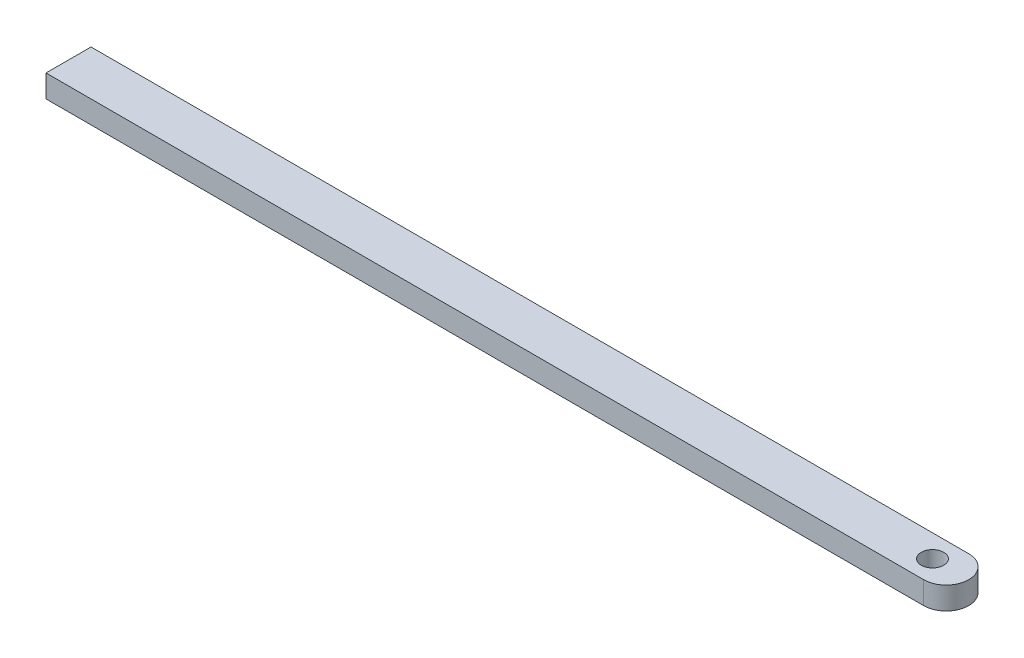
ISO-10303-21;
HEADER;
FILE_DESCRIPTION(('STEP AP214'),'2;1');
FILE_NAME('part.step','',(''),(''),'','','');
FILE_SCHEMA(('AUTOMOTIVE_DESIGN { 1 0 10303 214 1 1 1 1 }'));
ENDSEC;
DATA;
#1=APPLICATION_CONTEXT('core data for automotive mechanical design processes');
#2=APPLICATION_PROTOCOL_DEFINITION('international standard','automotive_design',2000,#1);
#3=PRODUCT_CONTEXT('',#1,'mechanical');
#4=PRODUCT('Part','Part','',(#3));
#5=PRODUCT_RELATED_PRODUCT_CATEGORY('part','',(#4));
#6=PRODUCT_DEFINITION_FORMATION('','',#4);
#7=PRODUCT_DEFINITION_CONTEXT('part definition',#1,'design');
#8=PRODUCT_DEFINITION('design','',#6,#7);
#9=PRODUCT_DEFINITION_SHAPE('','',#8);
#10=(LENGTH_UNIT() NAMED_UNIT(*) SI_UNIT(.MILLI.,.METRE.));
#11=(NAMED_UNIT(*) PLANE_ANGLE_UNIT() SI_UNIT($,.RADIAN.));
#12=(NAMED_UNIT(*) SI_UNIT($,.STERADIAN.) SOLID_ANGLE_UNIT());
#13=UNCERTAINTY_MEASURE_WITH_UNIT(LENGTH_MEASURE(1.E-05),#10,'distance_accuracy_value','');
#14=(GEOMETRIC_REPRESENTATION_CONTEXT(3) GLOBAL_UNCERTAINTY_ASSIGNED_CONTEXT((#13)) GLOBAL_UNIT_ASSIGNED_CONTEXT((#10,
#11,#12)) REPRESENTATION_CONTEXT('',''));
#15=CARTESIAN_POINT('',(0.,0.,0.));
#16=DIRECTION('',(0.,0.,1.));
#17=DIRECTION('',(1.,0.,0.));
#18=AXIS2_PLACEMENT_3D('',#15,#16,#17);
#19=CARTESIAN_POINT('',(279.044360902256,10.,13.6732731770124));
#20=DIRECTION('',(0.,-1.,0.));
#21=DIRECTION('',(0.,0.,-1.));
#22=AXIS2_PLACEMENT_3D('',#19,#20,#21);
#23=CYLINDRICAL_SURFACE('',#22,10.);
#24=DIRECTION('',(0.,-1.,0.));
#25=VECTOR('',#24,1.);
#26=CARTESIAN_POINT('',(279.044360902256,10.,3.67327317701239));
#27=LINE('',#26,#25);
#28=CARTESIAN_POINT('',(279.044360902256,10.,3.67327317701239));
#29=VERTEX_POINT('',#28);
#30=CARTESIAN_POINT('',(279.044360902256,0.,3.67327317701239));
#31=VERTEX_POINT('',#30);
#32=EDGE_CURVE('E97',#29,#31,#27,.T.);
#33=ORIENTED_EDGE('',*,*,#32,.F.);
#34=CARTESIAN_POINT('',(279.044360902256,10.,13.6732731770124));
#35=DIRECTION('',(0.,1.,0.));
#36=DIRECTION('',(0.,0.,1.));
#37=AXIS2_PLACEMENT_3D('',#34,#35,#36);
#38=CIRCLE('',#37,10.);
#39=CARTESIAN_POINT('',(279.044360902256,10.,23.6732731770124));
#40=VERTEX_POINT('',#39);
#41=EDGE_CURVE('E43',#40,#29,#38,.T.);
#42=ORIENTED_EDGE('',*,*,#41,.F.);
#43=DIRECTION('',(0.,-1.,0.));
#44=VECTOR('',#43,1.);
#45=CARTESIAN_POINT('',(279.044360902256,10.,23.6732731770124));
#46=LINE('',#45,#44);
#47=CARTESIAN_POINT('',(279.044360902256,0.,23.6732731770124));
#48=VERTEX_POINT('',#47);
#49=EDGE_CURVE('E80',#48,#40,#46,.F.);
#50=ORIENTED_EDGE('',*,*,#49,.F.);
#51=CARTESIAN_POINT('',(279.044360902256,0.,13.6732731770124));
#52=DIRECTION('',(0.,1.,0.));
#53=DIRECTION('',(0.,0.,1.));
#54=AXIS2_PLACEMENT_3D('',#51,#52,#53);
#55=CIRCLE('',#54,10.);
#56=EDGE_CURVE('E11',#31,#48,#55,.F.);
#57=ORIENTED_EDGE('',*,*,#56,.F.);
#58=EDGE_LOOP('',(#33,#42,#50,#57));
#59=FACE_BOUND('',#58,.T.);
#60=ADVANCED_FACE('F35',(#59),#23,.T.);
#61=CARTESIAN_POINT('',(0.,10.,0.));
#62=DIRECTION('',(0.,1.,0.));
#63=DIRECTION('',(0.,0.,1.));
#64=AXIS2_PLACEMENT_3D('',#61,#62,#63);
#65=PLANE('',#64);
#66=DIRECTION('',(1.,0.,0.));
#67=VECTOR('',#66,1.);
#68=CARTESIAN_POINT('',(-110.955639097744,10.,23.6732731770124));
#69=LINE('',#68,#67);
#70=CARTESIAN_POINT('',(-110.955639097744,10.,23.6732731770124));
#71=VERTEX_POINT('',#70);
#72=EDGE_CURVE('E73',#71,#40,#69,.T.);
#73=ORIENTED_EDGE('',*,*,#72,.T.);
#74=ORIENTED_EDGE('',*,*,#41,.T.);
#75=DIRECTION('',(-1.,0.,0.));
#76=VECTOR('',#75,1.);
#77=CARTESIAN_POINT('',(-110.955639097744,10.,3.67327317701239));
#78=LINE('',#77,#76);
#79=CARTESIAN_POINT('',(-110.955639097744,10.,3.67327317701239));
#80=VERTEX_POINT('',#79);
#81=EDGE_CURVE('E82',#29,#80,#78,.T.);
#82=ORIENTED_EDGE('',*,*,#81,.T.);
#83=DIRECTION('',(0.,0.,1.));
#84=VECTOR('',#83,1.);
#85=CARTESIAN_POINT('',(-110.955639097744,10.,3.67327317701239));
#86=LINE('',#85,#84);
#87=EDGE_CURVE('E83',#80,#71,#86,.T.);
#88=ORIENTED_EDGE('',*,*,#87,.T.);
#89=EDGE_LOOP('',(#73,#74,#82,#88));
#90=FACE_BOUND('',#89,.T.);
#91=CARTESIAN_POINT('',(272.933671001681,10.,13.6732731770124));
#92=DIRECTION('',(0.,1.,0.));
#93=DIRECTION('',(0.,0.,1.));
#94=AXIS2_PLACEMENT_3D('',#91,#92,#93);
#95=CIRCLE('',#94,4.99999999999999);
#96=CARTESIAN_POINT('',(272.933671001681,10.,18.6732731770124));
#97=VERTEX_POINT('',#96);
#98=EDGE_CURVE('E111',#97,#97,#95,.T.);
#99=ORIENTED_EDGE('',*,*,#98,.F.);
#100=EDGE_LOOP('',(#99));
#101=FACE_BOUND('',#100,.T.);
#102=ADVANCED_FACE('F86',(#90,#101),#65,.T.);
#103=CARTESIAN_POINT('',(0.,0.,0.));
#104=DIRECTION('',(0.,1.,0.));
#105=DIRECTION('',(0.,0.,1.));
#106=AXIS2_PLACEMENT_3D('',#103,#104,#105);
#107=PLANE('',#106);
#108=DIRECTION('',(-1.,0.,0.));
#109=VECTOR('',#108,1.);
#110=CARTESIAN_POINT('',(-110.955639097744,0.,3.67327317701239));
#111=LINE('',#110,#109);
#112=CARTESIAN_POINT('',(-110.955639097744,0.,3.67327317701239));
#113=VERTEX_POINT('',#112);
#114=EDGE_CURVE('E92',#31,#113,#111,.T.);
#115=ORIENTED_EDGE('',*,*,#114,.F.);
#116=ORIENTED_EDGE('',*,*,#56,.T.);
#117=DIRECTION('',(1.,0.,0.));
#118=VECTOR('',#117,1.);
#119=CARTESIAN_POINT('',(-110.955639097744,0.,23.6732731770124));
#120=LINE('',#119,#118);
#121=CARTESIAN_POINT('',(-110.955639097744,0.,23.6732731770124));
#122=VERTEX_POINT('',#121);
#123=EDGE_CURVE('E110',#122,#48,#120,.T.);
#124=ORIENTED_EDGE('',*,*,#123,.F.);
#125=DIRECTION('',(0.,0.,1.));
#126=VECTOR('',#125,1.);
#127=CARTESIAN_POINT('',(-110.955639097744,0.,3.67327317701239));
#128=LINE('',#127,#126);
#129=EDGE_CURVE('E96',#113,#122,#128,.T.);
#130=ORIENTED_EDGE('',*,*,#129,.F.);
#131=EDGE_LOOP('',(#115,#116,#124,#130));
#132=FACE_BOUND('',#131,.T.);
#133=CARTESIAN_POINT('',(272.933671001681,0.,13.6732731770124));
#134=DIRECTION('',(0.,1.,0.));
#135=DIRECTION('',(0.,0.,1.));
#136=AXIS2_PLACEMENT_3D('',#133,#134,#135);
#137=CIRCLE('',#136,4.99999999999999);
#138=CARTESIAN_POINT('',(272.933671001681,0.,18.6732731770124));
#139=VERTEX_POINT('',#138);
#140=EDGE_CURVE('E118',#139,#139,#137,.T.);
#141=ORIENTED_EDGE('',*,*,#140,.T.);
#142=EDGE_LOOP('',(#141));
#143=FACE_BOUND('',#142,.T.);
#144=ADVANCED_FACE('F112',(#132,#143),#107,.F.);
#145=CARTESIAN_POINT('',(-110.955639097744,10.,3.67327317701239));
#146=DIRECTION('',(1.,0.,0.));
#147=DIRECTION('',(0.,0.,-1.));
#148=AXIS2_PLACEMENT_3D('',#145,#146,#147);
#149=PLANE('',#148);
#150=ORIENTED_EDGE('',*,*,#129,.T.);
#151=DIRECTION('',(0.,-1.,0.));
#152=VECTOR('',#151,1.);
#153=CARTESIAN_POINT('',(-110.955639097744,10.,23.6732731770124));
#154=LINE('',#153,#152);
#155=EDGE_CURVE('E78',#71,#122,#154,.T.);
#156=ORIENTED_EDGE('',*,*,#155,.F.);
#157=ORIENTED_EDGE('',*,*,#87,.F.);
#158=DIRECTION('',(0.,-1.,0.));
#159=VECTOR('',#158,1.);
#160=CARTESIAN_POINT('',(-110.955639097744,10.,3.67327317701239));
#161=LINE('',#160,#159);
#162=EDGE_CURVE('E98',#80,#113,#161,.T.);
#163=ORIENTED_EDGE('',*,*,#162,.T.);
#164=EDGE_LOOP('',(#150,#156,#157,#163));
#165=FACE_BOUND('',#164,.T.);
#166=ADVANCED_FACE('F94',(#165),#149,.F.);
#167=CARTESIAN_POINT('',(-110.955639097744,10.,23.6732731770124));
#168=DIRECTION('',(0.,0.,-1.));
#169=DIRECTION('',(-1.,0.,0.));
#170=AXIS2_PLACEMENT_3D('',#167,#168,#169);
#171=PLANE('',#170);
#172=ORIENTED_EDGE('',*,*,#123,.T.);
#173=ORIENTED_EDGE('',*,*,#49,.T.);
#174=ORIENTED_EDGE('',*,*,#72,.F.);
#175=ORIENTED_EDGE('',*,*,#155,.T.);
#176=EDGE_LOOP('',(#172,#173,#174,#175));
#177=FACE_BOUND('',#176,.T.);
#178=ADVANCED_FACE('F76',(#177),#171,.F.);
#179=CARTESIAN_POINT('',(-110.955639097744,10.,3.67327317701239));
#180=DIRECTION('',(0.,0.,1.));
#181=DIRECTION('',(1.,0.,0.));
#182=AXIS2_PLACEMENT_3D('',#179,#180,#181);
#183=PLANE('',#182);
#184=ORIENTED_EDGE('',*,*,#81,.F.);
#185=ORIENTED_EDGE('',*,*,#32,.T.);
#186=ORIENTED_EDGE('',*,*,#114,.T.);
#187=ORIENTED_EDGE('',*,*,#162,.F.);
#188=EDGE_LOOP('',(#184,#185,#186,#187));
#189=FACE_BOUND('',#188,.T.);
#190=ADVANCED_FACE('F106',(#189),#183,.F.);
#191=CARTESIAN_POINT('',(272.933671001681,10.,13.6732731770124));
#192=DIRECTION('',(0.,-1.,0.));
#193=DIRECTION('',(0.,0.,-1.));
#194=AXIS2_PLACEMENT_3D('',#191,#192,#193);
#195=CYLINDRICAL_SURFACE('',#194,4.99999999999999);
#196=ORIENTED_EDGE('',*,*,#98,.T.);
#197=EDGE_LOOP('',(#196));
#198=FACE_BOUND('',#197,.T.);
#199=ORIENTED_EDGE('',*,*,#140,.F.);
#200=EDGE_LOOP('',(#199));
#201=FACE_BOUND('',#200,.T.);
#202=ADVANCED_FACE('F125',(#198,#201),#195,.F.);
#203=CLOSED_SHELL('',(#60,#102,#144,#166,#178,#190,#202));
#204=MANIFOLD_SOLID_BREP('B2',#203);
#205=ADVANCED_BREP_SHAPE_REPRESENTATION('',(#18,#204),#14);
#206=SHAPE_DEFINITION_REPRESENTATION(#9,#205);
ENDSEC;
END-ISO-10303-21;
